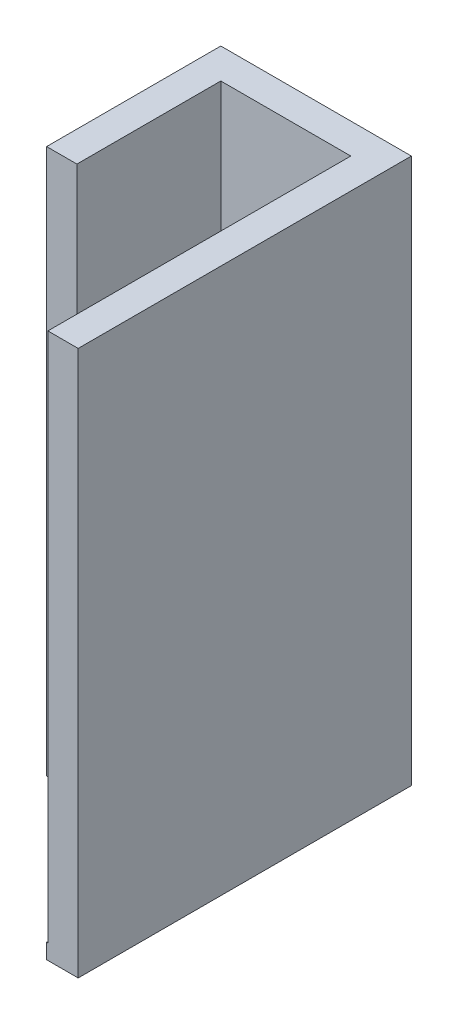
ISO-10303-21;
HEADER;
FILE_DESCRIPTION(('STEP AP214'),'2;1');
FILE_NAME('part.step','',(''),(''),'','','');
FILE_SCHEMA(('AUTOMOTIVE_DESIGN { 1 0 10303 214 1 1 1 1 }'));
ENDSEC;
DATA;
#1=APPLICATION_CONTEXT('core data for automotive mechanical design processes');
#2=APPLICATION_PROTOCOL_DEFINITION('international standard','automotive_design',2000,#1);
#3=PRODUCT_CONTEXT('',#1,'mechanical');
#4=PRODUCT('Part','Part','',(#3));
#5=PRODUCT_RELATED_PRODUCT_CATEGORY('part','',(#4));
#6=PRODUCT_DEFINITION_FORMATION('','',#4);
#7=PRODUCT_DEFINITION_CONTEXT('part definition',#1,'design');
#8=PRODUCT_DEFINITION('design','',#6,#7);
#9=PRODUCT_DEFINITION_SHAPE('','',#8);
#10=(LENGTH_UNIT() NAMED_UNIT(*) SI_UNIT(.MILLI.,.METRE.));
#11=(NAMED_UNIT(*) PLANE_ANGLE_UNIT() SI_UNIT($,.RADIAN.));
#12=(NAMED_UNIT(*) SI_UNIT($,.STERADIAN.) SOLID_ANGLE_UNIT());
#13=UNCERTAINTY_MEASURE_WITH_UNIT(LENGTH_MEASURE(1.E-05),#10,'distance_accuracy_value','');
#14=(GEOMETRIC_REPRESENTATION_CONTEXT(3) GLOBAL_UNCERTAINTY_ASSIGNED_CONTEXT((#13)) GLOBAL_UNIT_ASSIGNED_CONTEXT((#10,
#11,#12)) REPRESENTATION_CONTEXT('',''));
#15=CARTESIAN_POINT('',(0.,0.,0.));
#16=DIRECTION('',(0.,0.,1.));
#17=DIRECTION('',(1.,0.,0.));
#18=AXIS2_PLACEMENT_3D('',#15,#16,#17);
#19=CARTESIAN_POINT('',(0.,5486.4,0.));
#20=DIRECTION('',(-1.,0.,0.));
#21=DIRECTION('',(0.,0.,1.));
#22=AXIS2_PLACEMENT_3D('',#19,#20,#21);
#23=PLANE('',#22);
#24=DIRECTION('',(0.,-1.,0.));
#25=VECTOR('',#24,1.);
#26=CARTESIAN_POINT('',(0.,152.4,-2.54));
#27=LINE('',#26,#25);
#28=CARTESIAN_POINT('',(0.,152.4,-2.54));
#29=VERTEX_POINT('',#28);
#30=CARTESIAN_POINT('',(0.,0.,-2.54));
#31=VERTEX_POINT('',#30);
#32=EDGE_CURVE('E173',#29,#31,#27,.T.);
#33=ORIENTED_EDGE('',*,*,#32,.T.);
#34=DIRECTION('',(0.,0.,-1.));
#35=VECTOR('',#34,1.);
#36=CARTESIAN_POINT('',(0.,0.,0.));
#37=LINE('',#36,#35);
#38=CARTESIAN_POINT('',(0.,0.,-1447.8));
#39=VERTEX_POINT('',#38);
#40=EDGE_CURVE('E303',#31,#39,#37,.T.);
#41=ORIENTED_EDGE('',*,*,#40,.T.);
#42=DIRECTION('',(0.,-1.,0.));
#43=VECTOR('',#42,1.);
#44=CARTESIAN_POINT('',(0.,5486.4,-1447.8));
#45=LINE('',#44,#43);
#46=CARTESIAN_POINT('',(0.,5486.4,-1447.8));
#47=VERTEX_POINT('',#46);
#48=EDGE_CURVE('E48',#47,#39,#45,.T.);
#49=ORIENTED_EDGE('',*,*,#48,.F.);
#50=DIRECTION('',(0.,0.,-1.));
#51=VECTOR('',#50,1.);
#52=CARTESIAN_POINT('',(0.,5486.4,0.));
#53=LINE('',#52,#51);
#54=CARTESIAN_POINT('',(0.,5486.4,0.));
#55=VERTEX_POINT('',#54);
#56=EDGE_CURVE('E278',#55,#47,#53,.T.);
#57=ORIENTED_EDGE('',*,*,#56,.F.);
#58=DIRECTION('',(0.,-1.,0.));
#59=VECTOR('',#58,1.);
#60=CARTESIAN_POINT('',(0.,5486.4,0.));
#61=LINE('',#60,#59);
#62=CARTESIAN_POINT('',(0.,152.4,0.));
#63=VERTEX_POINT('',#62);
#64=EDGE_CURVE('E11',#55,#63,#61,.T.);
#65=ORIENTED_EDGE('',*,*,#64,.T.);
#66=DIRECTION('',(0.,0.,-1.));
#67=VECTOR('',#66,1.);
#68=CARTESIAN_POINT('',(0.,152.4,0.));
#69=LINE('',#68,#67);
#70=EDGE_CURVE('E54',#63,#29,#69,.T.);
#71=ORIENTED_EDGE('',*,*,#70,.T.);
#72=EDGE_LOOP('',(#33,#41,#49,#57,#65,#71));
#73=FACE_BOUND('',#72,.T.);
#74=ADVANCED_FACE('F39',(#73),#23,.F.);
#75=CARTESIAN_POINT('',(1308.1,5486.4,-1447.8));
#76=DIRECTION('',(1.,0.,0.));
#77=DIRECTION('',(0.,0.,-1.));
#78=AXIS2_PLACEMENT_3D('',#75,#76,#77);
#79=PLANE('',#78);
#80=DIRECTION('',(0.,-1.,0.));
#81=VECTOR('',#80,1.);
#82=CARTESIAN_POINT('',(1308.1,152.4,1597.66));
#83=LINE('',#82,#81);
#84=CARTESIAN_POINT('',(1308.1,152.4,1597.66));
#85=VERTEX_POINT('',#84);
#86=CARTESIAN_POINT('',(1308.1,0.,1597.66));
#87=VERTEX_POINT('',#86);
#88=EDGE_CURVE('E259',#85,#87,#83,.T.);
#89=ORIENTED_EDGE('',*,*,#88,.F.);
#90=DIRECTION('',(0.,0.,1.));
#91=VECTOR('',#90,1.);
#92=CARTESIAN_POINT('',(1308.1,152.4,1597.66));
#93=LINE('',#92,#91);
#94=CARTESIAN_POINT('',(1308.1,152.4,1600.2));
#95=VERTEX_POINT('',#94);
#96=EDGE_CURVE('E200',#85,#95,#93,.T.);
#97=ORIENTED_EDGE('',*,*,#96,.T.);
#98=DIRECTION('',(0.,-1.,0.));
#99=VECTOR('',#98,1.);
#100=CARTESIAN_POINT('',(1308.1,5486.4,1600.2));
#101=LINE('',#100,#99);
#102=CARTESIAN_POINT('',(1308.1,5486.4,1600.2));
#103=VERTEX_POINT('',#102);
#104=EDGE_CURVE('E337',#103,#95,#101,.T.);
#105=ORIENTED_EDGE('',*,*,#104,.F.);
#106=DIRECTION('',(0.,0.,1.));
#107=VECTOR('',#106,1.);
#108=CARTESIAN_POINT('',(1308.1,5486.4,-1447.8));
#109=LINE('',#108,#107);
#110=CARTESIAN_POINT('',(1308.1,5486.4,-1447.8));
#111=VERTEX_POINT('',#110);
#112=EDGE_CURVE('E285',#111,#103,#109,.T.);
#113=ORIENTED_EDGE('',*,*,#112,.F.);
#114=DIRECTION('',(0.,-1.,0.));
#115=VECTOR('',#114,1.);
#116=CARTESIAN_POINT('',(1308.1,5486.4,-1447.8));
#117=LINE('',#116,#115);
#118=CARTESIAN_POINT('',(1308.1,0.,-1447.8));
#119=VERTEX_POINT('',#118);
#120=EDGE_CURVE('E341',#111,#119,#117,.T.);
#121=ORIENTED_EDGE('',*,*,#120,.T.);
#122=DIRECTION('',(0.,0.,1.));
#123=VECTOR('',#122,1.);
#124=CARTESIAN_POINT('',(1308.1,0.,-1447.8));
#125=LINE('',#124,#123);
#126=EDGE_CURVE('E309',#119,#87,#125,.T.);
#127=ORIENTED_EDGE('',*,*,#126,.T.);
#128=EDGE_LOOP('',(#89,#97,#105,#113,#121,#127));
#129=FACE_BOUND('',#128,.T.);
#130=ADVANCED_FACE('F360',(#129),#79,.F.);
#131=CARTESIAN_POINT('',(0.,5486.4,0.));
#132=DIRECTION('',(0.,0.,-1.));
#133=DIRECTION('',(-1.,0.,0.));
#134=AXIS2_PLACEMENT_3D('',#131,#132,#133);
#135=PLANE('',#134);
#136=DIRECTION('',(1.,0.,0.));
#137=VECTOR('',#136,1.);
#138=CARTESIAN_POINT('',(0.,0.,0.));
#139=LINE('',#138,#137);
#140=CARTESIAN_POINT('',(-304.8,0.,0.));
#141=VERTEX_POINT('',#140);
#142=CARTESIAN_POINT('',(12.7,0.,0.));
#143=VERTEX_POINT('',#142);
#144=EDGE_CURVE('E167',#141,#143,#139,.T.);
#145=ORIENTED_EDGE('',*,*,#144,.T.);
#146=DIRECTION('',(0.,-1.,0.));
#147=VECTOR('',#146,1.);
#148=CARTESIAN_POINT('',(12.7,152.4,0.));
#149=LINE('',#148,#147);
#150=CARTESIAN_POINT('',(12.7,152.4,0.));
#151=VERTEX_POINT('',#150);
#152=EDGE_CURVE('E162',#151,#143,#149,.T.);
#153=ORIENTED_EDGE('',*,*,#152,.F.);
#154=DIRECTION('',(-1.,0.,0.));
#155=VECTOR('',#154,1.);
#156=CARTESIAN_POINT('',(0.,152.4,0.));
#157=LINE('',#156,#155);
#158=EDGE_CURVE('E164',#151,#63,#157,.T.);
#159=ORIENTED_EDGE('',*,*,#158,.T.);
#160=ORIENTED_EDGE('',*,*,#64,.F.);
#161=DIRECTION('',(1.,0.,0.));
#162=VECTOR('',#161,1.);
#163=CARTESIAN_POINT('',(0.,5486.4,0.));
#164=LINE('',#163,#162);
#165=CARTESIAN_POINT('',(-304.8,5486.4,0.));
#166=VERTEX_POINT('',#165);
#167=EDGE_CURVE('E274',#166,#55,#164,.T.);
#168=ORIENTED_EDGE('',*,*,#167,.F.);
#169=DIRECTION('',(0.,-1.,0.));
#170=VECTOR('',#169,1.);
#171=CARTESIAN_POINT('',(-304.8,5486.4,0.));
#172=LINE('',#171,#170);
#173=EDGE_CURVE('E300',#166,#141,#172,.T.);
#174=ORIENTED_EDGE('',*,*,#173,.T.);
#175=EDGE_LOOP('',(#145,#153,#159,#160,#168,#174));
#176=FACE_BOUND('',#175,.T.);
#177=ADVANCED_FACE('F41',(#176),#135,.F.);
#178=CARTESIAN_POINT('',(0.,5486.4,-1447.8));
#179=DIRECTION('',(0.,0.,-1.));
#180=DIRECTION('',(-1.,0.,0.));
#181=AXIS2_PLACEMENT_3D('',#178,#179,#180);
#182=PLANE('',#181);
#183=DIRECTION('',(1.,0.,0.));
#184=VECTOR('',#183,1.);
#185=CARTESIAN_POINT('',(0.,0.,-1447.8));
#186=LINE('',#185,#184);
#187=EDGE_CURVE('E306',#39,#119,#186,.T.);
#188=ORIENTED_EDGE('',*,*,#187,.T.);
#189=ORIENTED_EDGE('',*,*,#120,.F.);
#190=DIRECTION('',(1.,0.,0.));
#191=VECTOR('',#190,1.);
#192=CARTESIAN_POINT('',(0.,5486.4,-1447.8));
#193=LINE('',#192,#191);
#194=EDGE_CURVE('E282',#47,#111,#193,.T.);
#195=ORIENTED_EDGE('',*,*,#194,.F.);
#196=ORIENTED_EDGE('',*,*,#48,.T.);
#197=EDGE_LOOP('',(#188,#189,#195,#196));
#198=FACE_BOUND('',#197,.T.);
#199=ADVANCED_FACE('F350',(#198),#182,.F.);
#200=CARTESIAN_POINT('',(1308.1,5486.4,1600.2));
#201=DIRECTION('',(0.,0.,-1.));
#202=DIRECTION('',(-1.,0.,0.));
#203=AXIS2_PLACEMENT_3D('',#200,#201,#202);
#204=PLANE('',#203);
#205=DIRECTION('',(1.,0.,0.));
#206=VECTOR('',#205,1.);
#207=CARTESIAN_POINT('',(1308.1,0.,1600.2));
#208=LINE('',#207,#206);
#209=CARTESIAN_POINT('',(1295.4,0.,1600.2));
#210=VERTEX_POINT('',#209);
#211=CARTESIAN_POINT('',(1612.9,0.,1600.2));
#212=VERTEX_POINT('',#211);
#213=EDGE_CURVE('E312',#210,#212,#208,.T.);
#214=ORIENTED_EDGE('',*,*,#213,.T.);
#215=DIRECTION('',(0.,-1.,0.));
#216=VECTOR('',#215,1.);
#217=CARTESIAN_POINT('',(1612.9,5486.4,1600.2));
#218=LINE('',#217,#216);
#219=CARTESIAN_POINT('',(1612.9,5486.4,1600.2));
#220=VERTEX_POINT('',#219);
#221=EDGE_CURVE('E333',#220,#212,#218,.T.);
#222=ORIENTED_EDGE('',*,*,#221,.F.);
#223=DIRECTION('',(1.,0.,0.));
#224=VECTOR('',#223,1.);
#225=CARTESIAN_POINT('',(1308.1,5486.4,1600.2));
#226=LINE('',#225,#224);
#227=EDGE_CURVE('E288',#103,#220,#226,.T.);
#228=ORIENTED_EDGE('',*,*,#227,.F.);
#229=ORIENTED_EDGE('',*,*,#104,.T.);
#230=DIRECTION('',(-1.,0.,0.));
#231=VECTOR('',#230,1.);
#232=CARTESIAN_POINT('',(1308.1,152.4,1600.2));
#233=LINE('',#232,#231);
#234=CARTESIAN_POINT('',(1295.4,152.4,1600.2));
#235=VERTEX_POINT('',#234);
#236=EDGE_CURVE('E196',#95,#235,#233,.T.);
#237=ORIENTED_EDGE('',*,*,#236,.T.);
#238=DIRECTION('',(0.,-1.,0.));
#239=VECTOR('',#238,1.);
#240=CARTESIAN_POINT('',(1295.4,152.4,1600.2));
#241=LINE('',#240,#239);
#242=EDGE_CURVE('E263',#235,#210,#241,.T.);
#243=ORIENTED_EDGE('',*,*,#242,.T.);
#244=EDGE_LOOP('',(#214,#222,#228,#229,#237,#243));
#245=FACE_BOUND('',#244,.T.);
#246=ADVANCED_FACE('F373',(#245),#204,.F.);
#247=CARTESIAN_POINT('',(1612.9,5486.4,-1752.6));
#248=DIRECTION('',(-1.,0.,0.));
#249=DIRECTION('',(0.,0.,1.));
#250=AXIS2_PLACEMENT_3D('',#247,#248,#249);
#251=PLANE('',#250);
#252=DIRECTION('',(0.,0.,-1.));
#253=VECTOR('',#252,1.);
#254=CARTESIAN_POINT('',(1612.9,0.,-1752.6));
#255=LINE('',#254,#253);
#256=CARTESIAN_POINT('',(1612.9,0.,-1752.6));
#257=VERTEX_POINT('',#256);
#258=EDGE_CURVE('E315',#212,#257,#255,.T.);
#259=ORIENTED_EDGE('',*,*,#258,.T.);
#260=DIRECTION('',(0.,-1.,0.));
#261=VECTOR('',#260,1.);
#262=CARTESIAN_POINT('',(1612.9,5486.4,-1752.6));
#263=LINE('',#262,#261);
#264=CARTESIAN_POINT('',(1612.9,5486.4,-1752.6));
#265=VERTEX_POINT('',#264);
#266=EDGE_CURVE('E329',#265,#257,#263,.T.);
#267=ORIENTED_EDGE('',*,*,#266,.F.);
#268=DIRECTION('',(0.,0.,-1.));
#269=VECTOR('',#268,1.);
#270=CARTESIAN_POINT('',(1612.9,5486.4,-1752.6));
#271=LINE('',#270,#269);
#272=EDGE_CURVE('E291',#220,#265,#271,.T.);
#273=ORIENTED_EDGE('',*,*,#272,.F.);
#274=ORIENTED_EDGE('',*,*,#221,.T.);
#275=EDGE_LOOP('',(#259,#267,#273,#274));
#276=FACE_BOUND('',#275,.T.);
#277=ADVANCED_FACE('F392',(#276),#251,.F.);
#278=CARTESIAN_POINT('',(-304.8,5486.4,-1752.6));
#279=DIRECTION('',(0.,0.,1.));
#280=DIRECTION('',(1.,0.,0.));
#281=AXIS2_PLACEMENT_3D('',#278,#279,#280);
#282=PLANE('',#281);
#283=DIRECTION('',(-1.,0.,0.));
#284=VECTOR('',#283,1.);
#285=CARTESIAN_POINT('',(-304.8,0.,-1752.6));
#286=LINE('',#285,#284);
#287=CARTESIAN_POINT('',(-304.8,0.,-1752.6));
#288=VERTEX_POINT('',#287);
#289=EDGE_CURVE('E318',#257,#288,#286,.T.);
#290=ORIENTED_EDGE('',*,*,#289,.T.);
#291=DIRECTION('',(0.,-1.,0.));
#292=VECTOR('',#291,1.);
#293=CARTESIAN_POINT('',(-304.8,5486.4,-1752.6));
#294=LINE('',#293,#292);
#295=CARTESIAN_POINT('',(-304.8,5486.4,-1752.6));
#296=VERTEX_POINT('',#295);
#297=EDGE_CURVE('E325',#296,#288,#294,.T.);
#298=ORIENTED_EDGE('',*,*,#297,.F.);
#299=DIRECTION('',(-1.,0.,0.));
#300=VECTOR('',#299,1.);
#301=CARTESIAN_POINT('',(-304.8,5486.4,-1752.6));
#302=LINE('',#301,#300);
#303=EDGE_CURVE('E294',#265,#296,#302,.T.);
#304=ORIENTED_EDGE('',*,*,#303,.F.);
#305=ORIENTED_EDGE('',*,*,#266,.T.);
#306=EDGE_LOOP('',(#290,#298,#304,#305));
#307=FACE_BOUND('',#306,.T.);
#308=ADVANCED_FACE('F395',(#307),#282,.F.);
#309=CARTESIAN_POINT('',(-304.8,5486.4,0.));
#310=DIRECTION('',(1.,0.,0.));
#311=DIRECTION('',(0.,0.,-1.));
#312=AXIS2_PLACEMENT_3D('',#309,#310,#311);
#313=PLANE('',#312);
#314=DIRECTION('',(0.,0.,1.));
#315=VECTOR('',#314,1.);
#316=CARTESIAN_POINT('',(-304.8,0.,0.));
#317=LINE('',#316,#315);
#318=EDGE_CURVE('E279',#288,#141,#317,.T.);
#319=ORIENTED_EDGE('',*,*,#318,.T.);
#320=ORIENTED_EDGE('',*,*,#173,.F.);
#321=DIRECTION('',(0.,0.,1.));
#322=VECTOR('',#321,1.);
#323=CARTESIAN_POINT('',(-304.8,5486.4,0.));
#324=LINE('',#323,#322);
#325=EDGE_CURVE('E297',#296,#166,#324,.T.);
#326=ORIENTED_EDGE('',*,*,#325,.F.);
#327=ORIENTED_EDGE('',*,*,#297,.T.);
#328=EDGE_LOOP('',(#319,#320,#326,#327));
#329=FACE_BOUND('',#328,.T.);
#330=ADVANCED_FACE('F399',(#329),#313,.F.);
#331=CARTESIAN_POINT('',(0.,5486.4,0.));
#332=DIRECTION('',(0.,-1.,0.));
#333=DIRECTION('',(0.,0.,-1.));
#334=AXIS2_PLACEMENT_3D('',#331,#332,#333);
#335=PLANE('',#334);
#336=ORIENTED_EDGE('',*,*,#167,.T.);
#337=ORIENTED_EDGE('',*,*,#56,.T.);
#338=ORIENTED_EDGE('',*,*,#194,.T.);
#339=ORIENTED_EDGE('',*,*,#112,.T.);
#340=ORIENTED_EDGE('',*,*,#227,.T.);
#341=ORIENTED_EDGE('',*,*,#272,.T.);
#342=ORIENTED_EDGE('',*,*,#303,.T.);
#343=ORIENTED_EDGE('',*,*,#325,.T.);
#344=EDGE_LOOP('',(#336,#337,#338,#339,#340,#341,#342,#343));
#345=FACE_BOUND('',#344,.T.);
#346=ADVANCED_FACE('F377',(#345),#335,.F.);
#347=CARTESIAN_POINT('',(0.,0.,0.));
#348=DIRECTION('',(0.,-1.,0.));
#349=DIRECTION('',(0.,0.,-1.));
#350=AXIS2_PLACEMENT_3D('',#347,#348,#349);
#351=PLANE('',#350);
#352=ORIENTED_EDGE('',*,*,#40,.F.);
#353=DIRECTION('',(1.,0.,0.));
#354=VECTOR('',#353,1.);
#355=CARTESIAN_POINT('',(0.,0.,-2.54));
#356=LINE('',#355,#354);
#357=CARTESIAN_POINT('',(10.16,0.,-2.54));
#358=VERTEX_POINT('',#357);
#359=EDGE_CURVE('E216',#358,#31,#356,.F.);
#360=ORIENTED_EDGE('',*,*,#359,.F.);
#361=DIRECTION('',(0.,0.,1.));
#362=VECTOR('',#361,1.);
#363=CARTESIAN_POINT('',(10.16,0.,0.));
#364=LINE('',#363,#362);
#365=CARTESIAN_POINT('',(10.16,0.,-1437.64));
#366=VERTEX_POINT('',#365);
#367=EDGE_CURVE('E240',#366,#358,#364,.T.);
#368=ORIENTED_EDGE('',*,*,#367,.F.);
#369=DIRECTION('',(1.,0.,0.));
#370=VECTOR('',#369,1.);
#371=CARTESIAN_POINT('',(12.7,0.,-1437.64));
#372=LINE('',#371,#370);
#373=CARTESIAN_POINT('',(1297.94,0.,-1437.64));
#374=VERTEX_POINT('',#373);
#375=EDGE_CURVE('E237',#374,#366,#372,.F.);
#376=ORIENTED_EDGE('',*,*,#375,.F.);
#377=DIRECTION('',(0.,0.,-1.));
#378=VECTOR('',#377,1.);
#379=CARTESIAN_POINT('',(1297.94,0.,-1435.1));
#380=LINE('',#379,#378);
#381=CARTESIAN_POINT('',(1297.94,0.,1597.66));
#382=VERTEX_POINT('',#381);
#383=EDGE_CURVE('E234',#382,#374,#380,.T.);
#384=ORIENTED_EDGE('',*,*,#383,.F.);
#385=DIRECTION('',(1.,0.,0.));
#386=VECTOR('',#385,1.);
#387=CARTESIAN_POINT('',(1308.1,0.,1597.66));
#388=LINE('',#387,#386);
#389=EDGE_CURVE('E231',#87,#382,#388,.F.);
#390=ORIENTED_EDGE('',*,*,#389,.F.);
#391=ORIENTED_EDGE('',*,*,#126,.F.);
#392=ORIENTED_EDGE('',*,*,#187,.F.);
#393=EDGE_LOOP('',(#352,#360,#368,#376,#384,#390,#391,#392));
#394=FACE_BOUND('',#393,.T.);
#395=ORIENTED_EDGE('',*,*,#144,.F.);
#396=ORIENTED_EDGE('',*,*,#318,.F.);
#397=ORIENTED_EDGE('',*,*,#289,.F.);
#398=ORIENTED_EDGE('',*,*,#258,.F.);
#399=ORIENTED_EDGE('',*,*,#213,.F.);
#400=DIRECTION('',(0.,0.,-1.));
#401=VECTOR('',#400,1.);
#402=CARTESIAN_POINT('',(1295.4,0.,-1435.1));
#403=LINE('',#402,#401);
#404=CARTESIAN_POINT('',(1295.4,0.,-1435.1));
#405=VERTEX_POINT('',#404);
#406=EDGE_CURVE('E227',#210,#405,#403,.T.);
#407=ORIENTED_EDGE('',*,*,#406,.T.);
#408=DIRECTION('',(-1.,0.,0.));
#409=VECTOR('',#408,1.);
#410=CARTESIAN_POINT('',(12.7,0.,-1435.1));
#411=LINE('',#410,#409);
#412=CARTESIAN_POINT('',(12.7,0.,-1435.1));
#413=VERTEX_POINT('',#412);
#414=EDGE_CURVE('E223',#405,#413,#411,.T.);
#415=ORIENTED_EDGE('',*,*,#414,.T.);
#416=DIRECTION('',(0.,0.,1.));
#417=VECTOR('',#416,1.);
#418=CARTESIAN_POINT('',(12.7,0.,0.));
#419=LINE('',#418,#417);
#420=EDGE_CURVE('E220',#413,#143,#419,.T.);
#421=ORIENTED_EDGE('',*,*,#420,.T.);
#422=EDGE_LOOP('',(#395,#396,#397,#398,#399,#407,#415,#421));
#423=FACE_BOUND('',#422,.T.);
#424=ADVANCED_FACE('F354',(#394,#423),#351,.T.);
#425=CARTESIAN_POINT('',(0.,152.4,-2.54));
#426=DIRECTION('',(0.,0.,1.));
#427=DIRECTION('',(1.,0.,0.));
#428=AXIS2_PLACEMENT_3D('',#425,#426,#427);
#429=PLANE('',#428);
#430=ORIENTED_EDGE('',*,*,#359,.T.);
#431=ORIENTED_EDGE('',*,*,#32,.F.);
#432=DIRECTION('',(1.,0.,0.));
#433=VECTOR('',#432,1.);
#434=CARTESIAN_POINT('',(0.,152.4,-2.54));
#435=LINE('',#434,#433);
#436=CARTESIAN_POINT('',(10.16,152.4,-2.54));
#437=VERTEX_POINT('',#436);
#438=EDGE_CURVE('E243',#437,#29,#435,.F.);
#439=ORIENTED_EDGE('',*,*,#438,.F.);
#440=DIRECTION('',(0.,-1.,0.));
#441=VECTOR('',#440,1.);
#442=CARTESIAN_POINT('',(10.16,152.4,-2.54));
#443=LINE('',#442,#441);
#444=EDGE_CURVE('E215',#437,#358,#443,.T.);
#445=ORIENTED_EDGE('',*,*,#444,.T.);
#446=EDGE_LOOP('',(#430,#431,#439,#445));
#447=FACE_BOUND('',#446,.T.);
#448=ADVANCED_FACE('F406',(#447),#429,.F.);
#449=CARTESIAN_POINT('',(12.7,152.4,0.));
#450=DIRECTION('',(1.,0.,0.));
#451=DIRECTION('',(0.,0.,-1.));
#452=AXIS2_PLACEMENT_3D('',#449,#450,#451);
#453=PLANE('',#452);
#454=ORIENTED_EDGE('',*,*,#420,.F.);
#455=DIRECTION('',(0.,-1.,0.));
#456=VECTOR('',#455,1.);
#457=CARTESIAN_POINT('',(12.7,152.4,-1435.1));
#458=LINE('',#457,#456);
#459=CARTESIAN_POINT('',(12.7,152.4,-1435.1));
#460=VERTEX_POINT('',#459);
#461=EDGE_CURVE('E174',#460,#413,#458,.T.);
#462=ORIENTED_EDGE('',*,*,#461,.F.);
#463=DIRECTION('',(0.,0.,1.));
#464=VECTOR('',#463,1.);
#465=CARTESIAN_POINT('',(12.7,152.4,0.));
#466=LINE('',#465,#464);
#467=EDGE_CURVE('E180',#460,#151,#466,.T.);
#468=ORIENTED_EDGE('',*,*,#467,.T.);
#469=ORIENTED_EDGE('',*,*,#152,.T.);
#470=EDGE_LOOP('',(#454,#462,#468,#469));
#471=FACE_BOUND('',#470,.T.);
#472=ADVANCED_FACE('F184',(#471),#453,.T.);
#473=CARTESIAN_POINT('',(12.7,152.4,-1435.1));
#474=DIRECTION('',(0.,0.,1.));
#475=DIRECTION('',(1.,0.,0.));
#476=AXIS2_PLACEMENT_3D('',#473,#474,#475);
#477=PLANE('',#476);
#478=ORIENTED_EDGE('',*,*,#414,.F.);
#479=DIRECTION('',(0.,-1.,0.));
#480=VECTOR('',#479,1.);
#481=CARTESIAN_POINT('',(1295.4,152.4,-1435.1));
#482=LINE('',#481,#480);
#483=CARTESIAN_POINT('',(1295.4,152.4,-1435.1));
#484=VERTEX_POINT('',#483);
#485=EDGE_CURVE('E267',#484,#405,#482,.T.);
#486=ORIENTED_EDGE('',*,*,#485,.F.);
#487=DIRECTION('',(-1.,0.,0.));
#488=VECTOR('',#487,1.);
#489=CARTESIAN_POINT('',(12.7,152.4,-1435.1));
#490=LINE('',#489,#488);
#491=EDGE_CURVE('E186',#484,#460,#490,.T.);
#492=ORIENTED_EDGE('',*,*,#491,.T.);
#493=ORIENTED_EDGE('',*,*,#461,.T.);
#494=EDGE_LOOP('',(#478,#486,#492,#493));
#495=FACE_BOUND('',#494,.T.);
#496=ADVANCED_FACE('F414',(#495),#477,.T.);
#497=CARTESIAN_POINT('',(1295.4,152.4,-1435.1));
#498=DIRECTION('',(-1.,0.,0.));
#499=DIRECTION('',(0.,0.,1.));
#500=AXIS2_PLACEMENT_3D('',#497,#498,#499);
#501=PLANE('',#500);
#502=ORIENTED_EDGE('',*,*,#406,.F.);
#503=ORIENTED_EDGE('',*,*,#242,.F.);
#504=DIRECTION('',(0.,0.,-1.));
#505=VECTOR('',#504,1.);
#506=CARTESIAN_POINT('',(1295.4,152.4,-1435.1));
#507=LINE('',#506,#505);
#508=EDGE_CURVE('E189',#235,#484,#507,.T.);
#509=ORIENTED_EDGE('',*,*,#508,.T.);
#510=ORIENTED_EDGE('',*,*,#485,.T.);
#511=EDGE_LOOP('',(#502,#503,#509,#510));
#512=FACE_BOUND('',#511,.T.);
#513=ADVANCED_FACE('F417',(#512),#501,.T.);
#514=CARTESIAN_POINT('',(1308.1,152.4,1597.66));
#515=DIRECTION('',(0.,0.,1.));
#516=DIRECTION('',(1.,0.,0.));
#517=AXIS2_PLACEMENT_3D('',#514,#515,#516);
#518=PLANE('',#517);
#519=ORIENTED_EDGE('',*,*,#389,.T.);
#520=DIRECTION('',(0.,-1.,0.));
#521=VECTOR('',#520,1.);
#522=CARTESIAN_POINT('',(1297.94,152.4,1597.66));
#523=LINE('',#522,#521);
#524=CARTESIAN_POINT('',(1297.94,152.4,1597.66));
#525=VERTEX_POINT('',#524);
#526=EDGE_CURVE('E255',#525,#382,#523,.T.);
#527=ORIENTED_EDGE('',*,*,#526,.F.);
#528=DIRECTION('',(1.,0.,0.));
#529=VECTOR('',#528,1.);
#530=CARTESIAN_POINT('',(1308.1,152.4,1597.66));
#531=LINE('',#530,#529);
#532=EDGE_CURVE('E203',#85,#525,#531,.F.);
#533=ORIENTED_EDGE('',*,*,#532,.F.);
#534=ORIENTED_EDGE('',*,*,#88,.T.);
#535=EDGE_LOOP('',(#519,#527,#533,#534));
#536=FACE_BOUND('',#535,.T.);
#537=ADVANCED_FACE('F364',(#536),#518,.F.);
#538=CARTESIAN_POINT('',(1297.94,152.4,-1435.1));
#539=DIRECTION('',(-1.,0.,0.));
#540=DIRECTION('',(0.,0.,1.));
#541=AXIS2_PLACEMENT_3D('',#538,#539,#540);
#542=PLANE('',#541);
#543=ORIENTED_EDGE('',*,*,#383,.T.);
#544=DIRECTION('',(0.,-1.,0.));
#545=VECTOR('',#544,1.);
#546=CARTESIAN_POINT('',(1297.94,152.4,-1437.64));
#547=LINE('',#546,#545);
#548=CARTESIAN_POINT('',(1297.94,152.4,-1437.64));
#549=VERTEX_POINT('',#548);
#550=EDGE_CURVE('E251',#549,#374,#547,.T.);
#551=ORIENTED_EDGE('',*,*,#550,.F.);
#552=DIRECTION('',(0.,0.,-1.));
#553=VECTOR('',#552,1.);
#554=CARTESIAN_POINT('',(1297.94,152.4,-1435.1));
#555=LINE('',#554,#553);
#556=EDGE_CURVE('E206',#525,#549,#555,.T.);
#557=ORIENTED_EDGE('',*,*,#556,.F.);
#558=ORIENTED_EDGE('',*,*,#526,.T.);
#559=EDGE_LOOP('',(#543,#551,#557,#558));
#560=FACE_BOUND('',#559,.T.);
#561=ADVANCED_FACE('F424',(#560),#542,.F.);
#562=CARTESIAN_POINT('',(12.7,152.4,-1437.64));
#563=DIRECTION('',(0.,0.,1.));
#564=DIRECTION('',(1.,0.,0.));
#565=AXIS2_PLACEMENT_3D('',#562,#563,#564);
#566=PLANE('',#565);
#567=ORIENTED_EDGE('',*,*,#375,.T.);
#568=DIRECTION('',(0.,-1.,0.));
#569=VECTOR('',#568,1.);
#570=CARTESIAN_POINT('',(10.16,152.4,-1437.64));
#571=LINE('',#570,#569);
#572=CARTESIAN_POINT('',(10.16,152.4,-1437.64));
#573=VERTEX_POINT('',#572);
#574=EDGE_CURVE('E247',#573,#366,#571,.T.);
#575=ORIENTED_EDGE('',*,*,#574,.F.);
#576=DIRECTION('',(1.,0.,0.));
#577=VECTOR('',#576,1.);
#578=CARTESIAN_POINT('',(12.7,152.4,-1437.64));
#579=LINE('',#578,#577);
#580=EDGE_CURVE('E209',#549,#573,#579,.F.);
#581=ORIENTED_EDGE('',*,*,#580,.F.);
#582=ORIENTED_EDGE('',*,*,#550,.T.);
#583=EDGE_LOOP('',(#567,#575,#581,#582));
#584=FACE_BOUND('',#583,.T.);
#585=ADVANCED_FACE('F427',(#584),#566,.F.);
#586=CARTESIAN_POINT('',(10.16,152.4,0.));
#587=DIRECTION('',(1.,0.,0.));
#588=DIRECTION('',(0.,0.,-1.));
#589=AXIS2_PLACEMENT_3D('',#586,#587,#588);
#590=PLANE('',#589);
#591=ORIENTED_EDGE('',*,*,#367,.T.);
#592=ORIENTED_EDGE('',*,*,#444,.F.);
#593=DIRECTION('',(0.,0.,1.));
#594=VECTOR('',#593,1.);
#595=CARTESIAN_POINT('',(10.16,152.4,0.));
#596=LINE('',#595,#594);
#597=EDGE_CURVE('E212',#573,#437,#596,.T.);
#598=ORIENTED_EDGE('',*,*,#597,.F.);
#599=ORIENTED_EDGE('',*,*,#574,.T.);
#600=EDGE_LOOP('',(#591,#592,#598,#599));
#601=FACE_BOUND('',#600,.T.);
#602=ADVANCED_FACE('F431',(#601),#590,.F.);
#603=CARTESIAN_POINT('',(0.,152.4,0.));
#604=DIRECTION('',(0.,1.,0.));
#605=DIRECTION('',(1.,0.,0.));
#606=AXIS2_PLACEMENT_3D('',#603,#604,#605);
#607=PLANE('',#606);
#608=ORIENTED_EDGE('',*,*,#438,.T.);
#609=ORIENTED_EDGE('',*,*,#70,.F.);
#610=ORIENTED_EDGE('',*,*,#158,.F.);
#611=ORIENTED_EDGE('',*,*,#467,.F.);
#612=ORIENTED_EDGE('',*,*,#491,.F.);
#613=ORIENTED_EDGE('',*,*,#508,.F.);
#614=ORIENTED_EDGE('',*,*,#236,.F.);
#615=ORIENTED_EDGE('',*,*,#96,.F.);
#616=ORIENTED_EDGE('',*,*,#532,.T.);
#617=ORIENTED_EDGE('',*,*,#556,.T.);
#618=ORIENTED_EDGE('',*,*,#580,.T.);
#619=ORIENTED_EDGE('',*,*,#597,.T.);
#620=EDGE_LOOP('',(#608,#609,#610,#611,#612,#613,#614,#615,#616,#617,#618,#619));
#621=FACE_BOUND('',#620,.T.);
#622=ADVANCED_FACE('F178',(#621),#607,.T.);
#623=CLOSED_SHELL('',(#74,#130,#177,#199,#246,#277,#308,#330,#346,#424,#448,#472,#496,#513,#537,
#561,#585,#602,#622));
#624=MANIFOLD_SOLID_BREP('B2',#623);
#625=ADVANCED_BREP_SHAPE_REPRESENTATION('',(#18,#624),#14);
#626=SHAPE_DEFINITION_REPRESENTATION(#9,#625);
ENDSEC;
END-ISO-10303-21;
